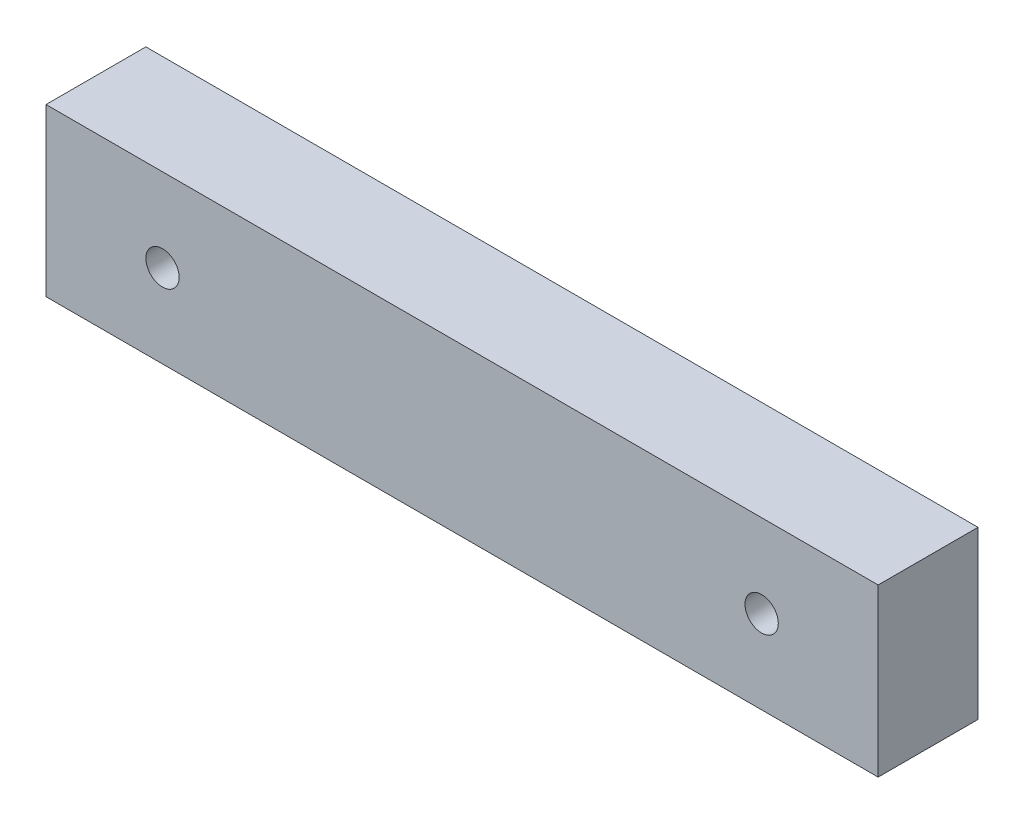
ISO-10303-21;
HEADER;
FILE_DESCRIPTION(('STEP AP214'),'2;1');
FILE_NAME('part.step','',(''),(''),'','','');
FILE_SCHEMA(('AUTOMOTIVE_DESIGN { 1 0 10303 214 1 1 1 1 }'));
ENDSEC;
DATA;
#1=APPLICATION_CONTEXT('core data for automotive mechanical design processes');
#2=APPLICATION_PROTOCOL_DEFINITION('international standard','automotive_design',2000,#1);
#3=PRODUCT_CONTEXT('',#1,'mechanical');
#4=PRODUCT('Part','Part','',(#3));
#5=PRODUCT_RELATED_PRODUCT_CATEGORY('part','',(#4));
#6=PRODUCT_DEFINITION_FORMATION('','',#4);
#7=PRODUCT_DEFINITION_CONTEXT('part definition',#1,'design');
#8=PRODUCT_DEFINITION('design','',#6,#7);
#9=PRODUCT_DEFINITION_SHAPE('','',#8);
#10=(LENGTH_UNIT() NAMED_UNIT(*) SI_UNIT(.MILLI.,.METRE.));
#11=(NAMED_UNIT(*) PLANE_ANGLE_UNIT() SI_UNIT($,.RADIAN.));
#12=(NAMED_UNIT(*) SI_UNIT($,.STERADIAN.) SOLID_ANGLE_UNIT());
#13=UNCERTAINTY_MEASURE_WITH_UNIT(LENGTH_MEASURE(1.E-05),#10,'distance_accuracy_value','');
#14=(GEOMETRIC_REPRESENTATION_CONTEXT(3) GLOBAL_UNCERTAINTY_ASSIGNED_CONTEXT((#13)) GLOBAL_UNIT_ASSIGNED_CONTEXT((#10,
#11,#12)) REPRESENTATION_CONTEXT('',''));
#15=CARTESIAN_POINT('',(0.,0.,0.));
#16=DIRECTION('',(0.,0.,1.));
#17=DIRECTION('',(1.,0.,0.));
#18=AXIS2_PLACEMENT_3D('',#15,#16,#17);
#19=CARTESIAN_POINT('',(0.,0.,15.));
#20=DIRECTION('',(0.,0.,1.));
#21=DIRECTION('',(1.,0.,0.));
#22=AXIS2_PLACEMENT_3D('',#19,#20,#21);
#23=PLANE('',#22);
#24=CARTESIAN_POINT('',(45.,0.,15.));
#25=DIRECTION('',(0.,0.,1.));
#26=DIRECTION('',(1.,0.,0.));
#27=AXIS2_PLACEMENT_3D('',#24,#25,#26);
#28=CIRCLE('',#27,2.5);
#29=CARTESIAN_POINT('',(47.5,0.,15.));
#30=VERTEX_POINT('',#29);
#31=EDGE_CURVE('E112',#30,#30,#28,.T.);
#32=ORIENTED_EDGE('',*,*,#31,.F.);
#33=EDGE_LOOP('',(#32));
#34=FACE_BOUND('',#33,.T.);
#35=DIRECTION('',(0.,1.,0.));
#36=VECTOR('',#35,1.);
#37=CARTESIAN_POINT('',(62.5,12.5,15.));
#38=LINE('',#37,#36);
#39=CARTESIAN_POINT('',(62.5,-12.5,15.));
#40=VERTEX_POINT('',#39);
#41=CARTESIAN_POINT('',(62.5,12.5,15.));
#42=VERTEX_POINT('',#41);
#43=EDGE_CURVE('E92',#40,#42,#38,.T.);
#44=ORIENTED_EDGE('',*,*,#43,.T.);
#45=DIRECTION('',(-1.,0.,0.));
#46=VECTOR('',#45,1.);
#47=CARTESIAN_POINT('',(-62.5,12.5,15.));
#48=LINE('',#47,#46);
#49=CARTESIAN_POINT('',(-62.5,12.5,15.));
#50=VERTEX_POINT('',#49);
#51=EDGE_CURVE('E87',#42,#50,#48,.T.);
#52=ORIENTED_EDGE('',*,*,#51,.T.);
#53=DIRECTION('',(0.,-1.,0.));
#54=VECTOR('',#53,1.);
#55=CARTESIAN_POINT('',(-62.5,12.5,15.));
#56=LINE('',#55,#54);
#57=CARTESIAN_POINT('',(-62.5,-12.5,15.));
#58=VERTEX_POINT('',#57);
#59=EDGE_CURVE('E90',#50,#58,#56,.T.);
#60=ORIENTED_EDGE('',*,*,#59,.T.);
#61=DIRECTION('',(1.,0.,0.));
#62=VECTOR('',#61,1.);
#63=CARTESIAN_POINT('',(-62.5,-12.5,15.));
#64=LINE('',#63,#62);
#65=EDGE_CURVE('E57',#58,#40,#64,.T.);
#66=ORIENTED_EDGE('',*,*,#65,.T.);
#67=EDGE_LOOP('',(#44,#52,#60,#66));
#68=FACE_BOUND('',#67,.T.);
#69=CARTESIAN_POINT('',(-45.,0.,15.));
#70=DIRECTION('',(0.,0.,1.));
#71=DIRECTION('',(-1.,0.,0.));
#72=AXIS2_PLACEMENT_3D('',#69,#70,#71);
#73=CIRCLE('',#72,2.5);
#74=CARTESIAN_POINT('',(-47.5,0.,15.));
#75=VERTEX_POINT('',#74);
#76=EDGE_CURVE('E134',#75,#75,#73,.T.);
#77=ORIENTED_EDGE('',*,*,#76,.F.);
#78=EDGE_LOOP('',(#77));
#79=FACE_BOUND('',#78,.T.);
#80=ADVANCED_FACE('F39',(#34,#68,#79),#23,.T.);
#81=CARTESIAN_POINT('',(0.,0.,0.));
#82=DIRECTION('',(0.,0.,1.));
#83=DIRECTION('',(1.,0.,0.));
#84=AXIS2_PLACEMENT_3D('',#81,#82,#83);
#85=PLANE('',#84);
#86=DIRECTION('',(0.,1.,0.));
#87=VECTOR('',#86,1.);
#88=CARTESIAN_POINT('',(62.5,12.5,0.));
#89=LINE('',#88,#87);
#90=CARTESIAN_POINT('',(62.5,-12.5,0.));
#91=VERTEX_POINT('',#90);
#92=CARTESIAN_POINT('',(62.5,12.5,0.));
#93=VERTEX_POINT('',#92);
#94=EDGE_CURVE('E108',#91,#93,#89,.T.);
#95=ORIENTED_EDGE('',*,*,#94,.F.);
#96=DIRECTION('',(1.,0.,0.));
#97=VECTOR('',#96,1.);
#98=CARTESIAN_POINT('',(-62.5,-12.5,0.));
#99=LINE('',#98,#97);
#100=CARTESIAN_POINT('',(-62.5,-12.5,0.));
#101=VERTEX_POINT('',#100);
#102=EDGE_CURVE('E80',#101,#91,#99,.T.);
#103=ORIENTED_EDGE('',*,*,#102,.F.);
#104=DIRECTION('',(0.,-1.,0.));
#105=VECTOR('',#104,1.);
#106=CARTESIAN_POINT('',(-62.5,12.5,0.));
#107=LINE('',#106,#105);
#108=CARTESIAN_POINT('',(-62.5,12.5,0.));
#109=VERTEX_POINT('',#108);
#110=EDGE_CURVE('E74',#109,#101,#107,.T.);
#111=ORIENTED_EDGE('',*,*,#110,.F.);
#112=DIRECTION('',(-1.,0.,0.));
#113=VECTOR('',#112,1.);
#114=CARTESIAN_POINT('',(-62.5,12.5,0.));
#115=LINE('',#114,#113);
#116=EDGE_CURVE('E97',#93,#109,#115,.T.);
#117=ORIENTED_EDGE('',*,*,#116,.F.);
#118=EDGE_LOOP('',(#95,#103,#111,#117));
#119=FACE_BOUND('',#118,.T.);
#120=CARTESIAN_POINT('',(45.,0.,0.));
#121=DIRECTION('',(0.,0.,1.));
#122=DIRECTION('',(1.,0.,0.));
#123=AXIS2_PLACEMENT_3D('',#120,#121,#122);
#124=CIRCLE('',#123,2.5);
#125=CARTESIAN_POINT('',(47.5,0.,0.));
#126=VERTEX_POINT('',#125);
#127=EDGE_CURVE('E130',#126,#126,#124,.T.);
#128=ORIENTED_EDGE('',*,*,#127,.T.);
#129=EDGE_LOOP('',(#128));
#130=FACE_BOUND('',#129,.T.);
#131=CARTESIAN_POINT('',(-45.,0.,0.));
#132=DIRECTION('',(0.,0.,1.));
#133=DIRECTION('',(-1.,0.,0.));
#134=AXIS2_PLACEMENT_3D('',#131,#132,#133);
#135=CIRCLE('',#134,2.5);
#136=CARTESIAN_POINT('',(-47.5,0.,0.));
#137=VERTEX_POINT('',#136);
#138=EDGE_CURVE('E138',#137,#137,#135,.T.);
#139=ORIENTED_EDGE('',*,*,#138,.T.);
#140=EDGE_LOOP('',(#139));
#141=FACE_BOUND('',#140,.T.);
#142=ADVANCED_FACE('F125',(#119,#130,#141),#85,.F.);
#143=CARTESIAN_POINT('',(62.5,12.5,15.));
#144=DIRECTION('',(-1.,0.,0.));
#145=DIRECTION('',(0.,0.,1.));
#146=AXIS2_PLACEMENT_3D('',#143,#144,#145);
#147=PLANE('',#146);
#148=ORIENTED_EDGE('',*,*,#94,.T.);
#149=DIRECTION('',(0.,0.,-1.));
#150=VECTOR('',#149,1.);
#151=CARTESIAN_POINT('',(62.5,12.5,15.));
#152=LINE('',#151,#150);
#153=EDGE_CURVE('E11',#42,#93,#152,.T.);
#154=ORIENTED_EDGE('',*,*,#153,.F.);
#155=ORIENTED_EDGE('',*,*,#43,.F.);
#156=DIRECTION('',(0.,0.,-1.));
#157=VECTOR('',#156,1.);
#158=CARTESIAN_POINT('',(62.5,-12.5,15.));
#159=LINE('',#158,#157);
#160=EDGE_CURVE('E104',#40,#91,#159,.T.);
#161=ORIENTED_EDGE('',*,*,#160,.T.);
#162=EDGE_LOOP('',(#148,#154,#155,#161));
#163=FACE_BOUND('',#162,.T.);
#164=ADVANCED_FACE('F41',(#163),#147,.F.);
#165=CARTESIAN_POINT('',(-62.5,12.5,15.));
#166=DIRECTION('',(0.,-1.,0.));
#167=DIRECTION('',(0.,0.,-1.));
#168=AXIS2_PLACEMENT_3D('',#165,#166,#167);
#169=PLANE('',#168);
#170=ORIENTED_EDGE('',*,*,#116,.T.);
#171=DIRECTION('',(0.,0.,-1.));
#172=VECTOR('',#171,1.);
#173=CARTESIAN_POINT('',(-62.5,12.5,15.));
#174=LINE('',#173,#172);
#175=EDGE_CURVE('E49',#50,#109,#174,.T.);
#176=ORIENTED_EDGE('',*,*,#175,.F.);
#177=ORIENTED_EDGE('',*,*,#51,.F.);
#178=ORIENTED_EDGE('',*,*,#153,.T.);
#179=EDGE_LOOP('',(#170,#176,#177,#178));
#180=FACE_BOUND('',#179,.T.);
#181=ADVANCED_FACE('F96',(#180),#169,.F.);
#182=CARTESIAN_POINT('',(-62.5,12.5,15.));
#183=DIRECTION('',(1.,0.,0.));
#184=DIRECTION('',(0.,0.,-1.));
#185=AXIS2_PLACEMENT_3D('',#182,#183,#184);
#186=PLANE('',#185);
#187=ORIENTED_EDGE('',*,*,#110,.T.);
#188=DIRECTION('',(0.,0.,-1.));
#189=VECTOR('',#188,1.);
#190=CARTESIAN_POINT('',(-62.5,-12.5,15.));
#191=LINE('',#190,#189);
#192=EDGE_CURVE('E99',#58,#101,#191,.T.);
#193=ORIENTED_EDGE('',*,*,#192,.F.);
#194=ORIENTED_EDGE('',*,*,#59,.F.);
#195=ORIENTED_EDGE('',*,*,#175,.T.);
#196=EDGE_LOOP('',(#187,#193,#194,#195));
#197=FACE_BOUND('',#196,.T.);
#198=ADVANCED_FACE('F100',(#197),#186,.F.);
#199=CARTESIAN_POINT('',(-62.5,-12.5,15.));
#200=DIRECTION('',(0.,1.,0.));
#201=DIRECTION('',(0.,0.,1.));
#202=AXIS2_PLACEMENT_3D('',#199,#200,#201);
#203=PLANE('',#202);
#204=ORIENTED_EDGE('',*,*,#102,.T.);
#205=ORIENTED_EDGE('',*,*,#160,.F.);
#206=ORIENTED_EDGE('',*,*,#65,.F.);
#207=ORIENTED_EDGE('',*,*,#192,.T.);
#208=EDGE_LOOP('',(#204,#205,#206,#207));
#209=FACE_BOUND('',#208,.T.);
#210=ADVANCED_FACE('F122',(#209),#203,.F.);
#211=CARTESIAN_POINT('',(45.,0.,15.));
#212=DIRECTION('',(0.,0.,-1.));
#213=DIRECTION('',(-1.,0.,0.));
#214=AXIS2_PLACEMENT_3D('',#211,#212,#213);
#215=CYLINDRICAL_SURFACE('',#214,2.5);
#216=ORIENTED_EDGE('',*,*,#31,.T.);
#217=EDGE_LOOP('',(#216));
#218=FACE_BOUND('',#217,.T.);
#219=ORIENTED_EDGE('',*,*,#127,.F.);
#220=EDGE_LOOP('',(#219));
#221=FACE_BOUND('',#220,.T.);
#222=ADVANCED_FACE('F157',(#218,#221),#215,.F.);
#223=CARTESIAN_POINT('',(-45.,0.,15.));
#224=DIRECTION('',(0.,0.,-1.));
#225=DIRECTION('',(-1.,0.,0.));
#226=AXIS2_PLACEMENT_3D('',#223,#224,#225);
#227=CYLINDRICAL_SURFACE('',#226,2.5);
#228=ORIENTED_EDGE('',*,*,#76,.T.);
#229=EDGE_LOOP('',(#228));
#230=FACE_BOUND('',#229,.T.);
#231=ORIENTED_EDGE('',*,*,#138,.F.);
#232=EDGE_LOOP('',(#231));
#233=FACE_BOUND('',#232,.T.);
#234=ADVANCED_FACE('F146',(#230,#233),#227,.F.);
#235=CLOSED_SHELL('',(#80,#142,#164,#181,#198,#210,#222,#234));
#236=MANIFOLD_SOLID_BREP('B2',#235);
#237=ADVANCED_BREP_SHAPE_REPRESENTATION('',(#18,#236),#14);
#238=SHAPE_DEFINITION_REPRESENTATION(#9,#237);
ENDSEC;
END-ISO-10303-21;
